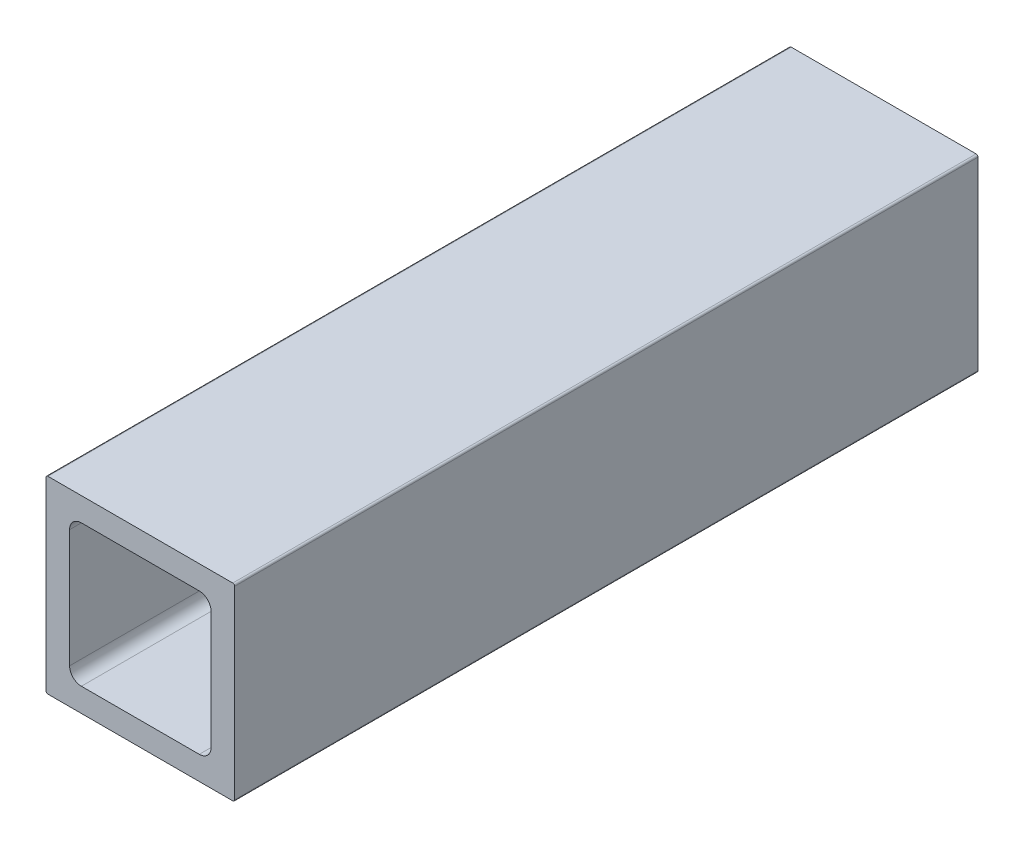
ISO-10303-21;
HEADER;
FILE_DESCRIPTION(('STEP AP214'),'2;1');
FILE_NAME('part.step','',(''),(''),'','','');
FILE_SCHEMA(('AUTOMOTIVE_DESIGN { 1 0 10303 214 1 1 1 1 }'));
ENDSEC;
DATA;
#1=APPLICATION_CONTEXT('core data for automotive mechanical design processes');
#2=APPLICATION_PROTOCOL_DEFINITION('international standard','automotive_design',2000,#1);
#3=PRODUCT_CONTEXT('',#1,'mechanical');
#4=PRODUCT('Part','Part','',(#3));
#5=PRODUCT_RELATED_PRODUCT_CATEGORY('part','',(#4));
#6=PRODUCT_DEFINITION_FORMATION('','',#4);
#7=PRODUCT_DEFINITION_CONTEXT('part definition',#1,'design');
#8=PRODUCT_DEFINITION('design','',#6,#7);
#9=PRODUCT_DEFINITION_SHAPE('','',#8);
#10=(LENGTH_UNIT() NAMED_UNIT(*) SI_UNIT(.MILLI.,.METRE.));
#11=(NAMED_UNIT(*) PLANE_ANGLE_UNIT() SI_UNIT($,.RADIAN.));
#12=(NAMED_UNIT(*) SI_UNIT($,.STERADIAN.) SOLID_ANGLE_UNIT());
#13=UNCERTAINTY_MEASURE_WITH_UNIT(LENGTH_MEASURE(1.E-05),#10,'distance_accuracy_value','');
#14=(GEOMETRIC_REPRESENTATION_CONTEXT(3) GLOBAL_UNCERTAINTY_ASSIGNED_CONTEXT((#13)) GLOBAL_UNIT_ASSIGNED_CONTEXT((#10,
#11,#12)) REPRESENTATION_CONTEXT('',''));
#15=CARTESIAN_POINT('',(0.,0.,0.));
#16=DIRECTION('',(0.,0.,1.));
#17=DIRECTION('',(1.,0.,0.));
#18=AXIS2_PLACEMENT_3D('',#15,#16,#17);
#19=CARTESIAN_POINT('',(0.254,0.254,1828.8));
#20=DIRECTION('',(0.,0.,-1.));
#21=DIRECTION('',(-1.,0.,0.));
#22=AXIS2_PLACEMENT_3D('',#19,#20,#21);
#23=CYLINDRICAL_SURFACE('',#22,0.254);
#24=DIRECTION('',(0.,0.,-1.));
#25=VECTOR('',#24,1.);
#26=CARTESIAN_POINT('',(0.,0.254,1828.8));
#27=LINE('',#26,#25);
#28=CARTESIAN_POINT('',(0.,0.254,1828.8));
#29=VERTEX_POINT('',#28);
#30=CARTESIAN_POINT('',(0.,0.254,1728.724));
#31=VERTEX_POINT('',#30);
#32=EDGE_CURVE('E265',#29,#31,#27,.T.);
#33=ORIENTED_EDGE('',*,*,#32,.T.);
#34=CARTESIAN_POINT('',(0.254,0.254,1728.724));
#35=DIRECTION('',(0.,0.,-1.));
#36=DIRECTION('',(-1.,0.,0.));
#37=AXIS2_PLACEMENT_3D('',#34,#35,#36);
#38=CIRCLE('',#37,0.254);
#39=CARTESIAN_POINT('',(0.254,0.,1728.724));
#40=VERTEX_POINT('',#39);
#41=EDGE_CURVE('E57',#31,#40,#38,.F.);
#42=ORIENTED_EDGE('',*,*,#41,.T.);
#43=DIRECTION('',(0.,0.,-1.));
#44=VECTOR('',#43,1.);
#45=CARTESIAN_POINT('',(0.254,0.,1828.8));
#46=LINE('',#45,#44);
#47=CARTESIAN_POINT('',(0.254,0.,1828.8));
#48=VERTEX_POINT('',#47);
#49=EDGE_CURVE('E261',#48,#40,#46,.T.);
#50=ORIENTED_EDGE('',*,*,#49,.F.);
#51=CARTESIAN_POINT('',(0.254,0.254,1828.8));
#52=DIRECTION('',(0.,0.,1.));
#53=DIRECTION('',(-1.,0.,0.));
#54=AXIS2_PLACEMENT_3D('',#51,#52,#53);
#55=CIRCLE('',#54,0.254);
#56=EDGE_CURVE('E50',#29,#48,#55,.T.);
#57=ORIENTED_EDGE('',*,*,#56,.F.);
#58=EDGE_LOOP('',(#33,#42,#50,#57));
#59=FACE_BOUND('',#58,.T.);
#60=ADVANCED_FACE('F42',(#59),#23,.T.);
#61=CARTESIAN_POINT('',(0.254,0.,1828.8));
#62=DIRECTION('',(0.,1.,0.));
#63=DIRECTION('',(1.,0.,0.));
#64=AXIS2_PLACEMENT_3D('',#61,#62,#63);
#65=PLANE('',#64);
#66=DIRECTION('',(-1.,0.,0.));
#67=VECTOR('',#66,1.);
#68=CARTESIAN_POINT('',(0.254,0.,1728.724));
#69=LINE('',#68,#67);
#70=CARTESIAN_POINT('',(25.146,0.,1728.724));
#71=VERTEX_POINT('',#70);
#72=EDGE_CURVE('E316',#71,#40,#69,.T.);
#73=ORIENTED_EDGE('',*,*,#72,.F.);
#74=DIRECTION('',(0.,0.,-1.));
#75=VECTOR('',#74,1.);
#76=CARTESIAN_POINT('',(25.146,0.,1828.8));
#77=LINE('',#76,#75);
#78=CARTESIAN_POINT('',(25.146,0.,1828.8));
#79=VERTEX_POINT('',#78);
#80=EDGE_CURVE('E215',#79,#71,#77,.T.);
#81=ORIENTED_EDGE('',*,*,#80,.F.);
#82=DIRECTION('',(1.,0.,0.));
#83=VECTOR('',#82,1.);
#84=CARTESIAN_POINT('',(0.254,0.,1828.8));
#85=LINE('',#84,#83);
#86=EDGE_CURVE('E207',#48,#79,#85,.T.);
#87=ORIENTED_EDGE('',*,*,#86,.F.);
#88=ORIENTED_EDGE('',*,*,#49,.T.);
#89=EDGE_LOOP('',(#73,#81,#87,#88));
#90=FACE_BOUND('',#89,.T.);
#91=ADVANCED_FACE('F349',(#90),#65,.F.);
#92=CARTESIAN_POINT('',(25.146,0.254,1828.8));
#93=DIRECTION('',(0.,0.,-1.));
#94=DIRECTION('',(-1.,0.,0.));
#95=AXIS2_PLACEMENT_3D('',#92,#93,#94);
#96=CYLINDRICAL_SURFACE('',#95,0.254);
#97=ORIENTED_EDGE('',*,*,#80,.T.);
#98=CARTESIAN_POINT('',(25.146,0.254,1728.724));
#99=DIRECTION('',(0.,0.,-1.));
#100=DIRECTION('',(-1.,0.,0.));
#101=AXIS2_PLACEMENT_3D('',#98,#99,#100);
#102=CIRCLE('',#101,0.254);
#103=CARTESIAN_POINT('',(25.4,0.254,1728.724));
#104=VERTEX_POINT('',#103);
#105=EDGE_CURVE('E313',#71,#104,#102,.F.);
#106=ORIENTED_EDGE('',*,*,#105,.T.);
#107=DIRECTION('',(0.,0.,-1.));
#108=VECTOR('',#107,1.);
#109=CARTESIAN_POINT('',(25.4,0.254,1828.8));
#110=LINE('',#109,#108);
#111=CARTESIAN_POINT('',(25.4,0.254,1828.8));
#112=VERTEX_POINT('',#111);
#113=EDGE_CURVE('E211',#112,#104,#110,.T.);
#114=ORIENTED_EDGE('',*,*,#113,.F.);
#115=CARTESIAN_POINT('',(25.146,0.254,1828.8));
#116=DIRECTION('',(0.,0.,1.));
#117=DIRECTION('',(1.,0.,0.));
#118=AXIS2_PLACEMENT_3D('',#115,#116,#117);
#119=CIRCLE('',#118,0.254);
#120=EDGE_CURVE('E210',#79,#112,#119,.T.);
#121=ORIENTED_EDGE('',*,*,#120,.F.);
#122=EDGE_LOOP('',(#97,#106,#114,#121));
#123=FACE_BOUND('',#122,.T.);
#124=ADVANCED_FACE('F345',(#123),#96,.T.);
#125=CARTESIAN_POINT('',(25.4,0.254,1828.8));
#126=DIRECTION('',(-1.,0.,0.));
#127=DIRECTION('',(0.,0.,1.));
#128=AXIS2_PLACEMENT_3D('',#125,#126,#127);
#129=PLANE('',#128);
#130=DIRECTION('',(0.,-1.,0.));
#131=VECTOR('',#130,1.);
#132=CARTESIAN_POINT('',(25.4,0.254,1728.724));
#133=LINE('',#132,#131);
#134=CARTESIAN_POINT('',(25.4,25.146,1728.724));
#135=VERTEX_POINT('',#134);
#136=EDGE_CURVE('E311',#135,#104,#133,.T.);
#137=ORIENTED_EDGE('',*,*,#136,.F.);
#138=DIRECTION('',(0.,0.,-1.));
#139=VECTOR('',#138,1.);
#140=CARTESIAN_POINT('',(25.4,25.146,1828.8));
#141=LINE('',#140,#139);
#142=CARTESIAN_POINT('',(25.4,25.146,1828.8));
#143=VERTEX_POINT('',#142);
#144=EDGE_CURVE('E216',#143,#135,#141,.T.);
#145=ORIENTED_EDGE('',*,*,#144,.F.);
#146=DIRECTION('',(0.,1.,0.));
#147=VECTOR('',#146,1.);
#148=CARTESIAN_POINT('',(25.4,0.254,1828.8));
#149=LINE('',#148,#147);
#150=EDGE_CURVE('E231',#112,#143,#149,.T.);
#151=ORIENTED_EDGE('',*,*,#150,.F.);
#152=ORIENTED_EDGE('',*,*,#113,.T.);
#153=EDGE_LOOP('',(#137,#145,#151,#152));
#154=FACE_BOUND('',#153,.T.);
#155=ADVANCED_FACE('F363',(#154),#129,.F.);
#156=CARTESIAN_POINT('',(25.146,25.146,1828.8));
#157=DIRECTION('',(0.,0.,-1.));
#158=DIRECTION('',(-1.,0.,0.));
#159=AXIS2_PLACEMENT_3D('',#156,#157,#158);
#160=CYLINDRICAL_SURFACE('',#159,0.254);
#161=ORIENTED_EDGE('',*,*,#144,.T.);
#162=CARTESIAN_POINT('',(25.146,25.146,1728.724));
#163=DIRECTION('',(0.,0.,-1.));
#164=DIRECTION('',(-1.,0.,0.));
#165=AXIS2_PLACEMENT_3D('',#162,#163,#164);
#166=CIRCLE('',#165,0.254);
#167=CARTESIAN_POINT('',(25.146,25.4,1728.724));
#168=VERTEX_POINT('',#167);
#169=EDGE_CURVE('E308',#135,#168,#166,.F.);
#170=ORIENTED_EDGE('',*,*,#169,.T.);
#171=DIRECTION('',(0.,0.,-1.));
#172=VECTOR('',#171,1.);
#173=CARTESIAN_POINT('',(25.146,25.4,1828.8));
#174=LINE('',#173,#172);
#175=CARTESIAN_POINT('',(25.146,25.4,1828.8));
#176=VERTEX_POINT('',#175);
#177=EDGE_CURVE('E197',#176,#168,#174,.T.);
#178=ORIENTED_EDGE('',*,*,#177,.F.);
#179=CARTESIAN_POINT('',(25.146,25.146,1828.8));
#180=DIRECTION('',(0.,0.,1.));
#181=DIRECTION('',(-1.,0.,0.));
#182=AXIS2_PLACEMENT_3D('',#179,#180,#181);
#183=CIRCLE('',#182,0.254);
#184=EDGE_CURVE('E235',#143,#176,#183,.T.);
#185=ORIENTED_EDGE('',*,*,#184,.F.);
#186=EDGE_LOOP('',(#161,#170,#178,#185));
#187=FACE_BOUND('',#186,.T.);
#188=ADVANCED_FACE('F360',(#187),#160,.T.);
#189=CARTESIAN_POINT('',(0.254,25.4,1828.8));
#190=DIRECTION('',(0.,-1.,0.));
#191=DIRECTION('',(0.,0.,-1.));
#192=AXIS2_PLACEMENT_3D('',#189,#190,#191);
#193=PLANE('',#192);
#194=DIRECTION('',(1.,0.,0.));
#195=VECTOR('',#194,1.);
#196=CARTESIAN_POINT('',(0.254,25.4,1728.724));
#197=LINE('',#196,#195);
#198=CARTESIAN_POINT('',(0.254,25.4,1728.724));
#199=VERTEX_POINT('',#198);
#200=EDGE_CURVE('E184',#199,#168,#197,.T.);
#201=ORIENTED_EDGE('',*,*,#200,.F.);
#202=DIRECTION('',(0.,0.,-1.));
#203=VECTOR('',#202,1.);
#204=CARTESIAN_POINT('',(0.254,25.4,1828.8));
#205=LINE('',#204,#203);
#206=CARTESIAN_POINT('',(0.254,25.4,1828.8));
#207=VERTEX_POINT('',#206);
#208=EDGE_CURVE('E183',#207,#199,#205,.T.);
#209=ORIENTED_EDGE('',*,*,#208,.F.);
#210=DIRECTION('',(-1.,0.,0.));
#211=VECTOR('',#210,1.);
#212=CARTESIAN_POINT('',(0.254,25.4,1828.8));
#213=LINE('',#212,#211);
#214=EDGE_CURVE('E269',#176,#207,#213,.T.);
#215=ORIENTED_EDGE('',*,*,#214,.F.);
#216=ORIENTED_EDGE('',*,*,#177,.T.);
#217=EDGE_LOOP('',(#201,#209,#215,#216));
#218=FACE_BOUND('',#217,.T.);
#219=ADVANCED_FACE('F357',(#218),#193,.F.);
#220=CARTESIAN_POINT('',(0.254,25.146,1828.8));
#221=DIRECTION('',(0.,0.,-1.));
#222=DIRECTION('',(-1.,0.,0.));
#223=AXIS2_PLACEMENT_3D('',#220,#221,#222);
#224=CYLINDRICAL_SURFACE('',#223,0.254);
#225=ORIENTED_EDGE('',*,*,#208,.T.);
#226=CARTESIAN_POINT('',(0.254,25.146,1728.724));
#227=DIRECTION('',(0.,0.,-1.));
#228=DIRECTION('',(-1.,0.,0.));
#229=AXIS2_PLACEMENT_3D('',#226,#227,#228);
#230=CIRCLE('',#229,0.254);
#231=CARTESIAN_POINT('',(0.,25.146,1728.724));
#232=VERTEX_POINT('',#231);
#233=EDGE_CURVE('E170',#199,#232,#230,.F.);
#234=ORIENTED_EDGE('',*,*,#233,.T.);
#235=DIRECTION('',(0.,0.,-1.));
#236=VECTOR('',#235,1.);
#237=CARTESIAN_POINT('',(0.,25.146,1828.8));
#238=LINE('',#237,#236);
#239=CARTESIAN_POINT('',(0.,25.146,1828.8));
#240=VERTEX_POINT('',#239);
#241=EDGE_CURVE('E181',#240,#232,#238,.T.);
#242=ORIENTED_EDGE('',*,*,#241,.F.);
#243=CARTESIAN_POINT('',(0.254,25.146,1828.8));
#244=DIRECTION('',(0.,0.,1.));
#245=DIRECTION('',(-1.,0.,0.));
#246=AXIS2_PLACEMENT_3D('',#243,#244,#245);
#247=CIRCLE('',#246,0.254);
#248=EDGE_CURVE('E266',#207,#240,#247,.T.);
#249=ORIENTED_EDGE('',*,*,#248,.F.);
#250=EDGE_LOOP('',(#225,#234,#242,#249));
#251=FACE_BOUND('',#250,.T.);
#252=ADVANCED_FACE('F180',(#251),#224,.T.);
#253=CARTESIAN_POINT('',(0.,0.254,1828.8));
#254=DIRECTION('',(1.,0.,0.));
#255=DIRECTION('',(0.,1.,0.));
#256=AXIS2_PLACEMENT_3D('',#253,#254,#255);
#257=PLANE('',#256);
#258=DIRECTION('',(0.,-1.,0.));
#259=VECTOR('',#258,1.);
#260=CARTESIAN_POINT('',(0.,128.21449467067,1728.724));
#261=LINE('',#260,#259);
#262=EDGE_CURVE('E167',#232,#31,#261,.T.);
#263=ORIENTED_EDGE('',*,*,#262,.T.);
#264=ORIENTED_EDGE('',*,*,#32,.F.);
#265=DIRECTION('',(0.,-1.,0.));
#266=VECTOR('',#265,1.);
#267=CARTESIAN_POINT('',(0.,0.254,1828.8));
#268=LINE('',#267,#266);
#269=EDGE_CURVE('E188',#240,#29,#268,.T.);
#270=ORIENTED_EDGE('',*,*,#269,.F.);
#271=ORIENTED_EDGE('',*,*,#241,.T.);
#272=EDGE_LOOP('',(#263,#264,#270,#271));
#273=FACE_BOUND('',#272,.T.);
#274=ADVANCED_FACE('F187',(#273),#257,.F.);
#275=CARTESIAN_POINT('',(4.7625,4.7625,1828.8));
#276=DIRECTION('',(0.,0.,-1.));
#277=DIRECTION('',(-1.,0.,0.));
#278=AXIS2_PLACEMENT_3D('',#275,#276,#277);
#279=CYLINDRICAL_SURFACE('',#278,1.5875);
#280=CARTESIAN_POINT('',(4.7625,4.7625,1728.724));
#281=DIRECTION('',(0.,0.,-1.));
#282=DIRECTION('',(-1.,0.,0.));
#283=AXIS2_PLACEMENT_3D('',#280,#281,#282);
#284=CIRCLE('',#283,1.5875);
#285=CARTESIAN_POINT('',(3.175,4.7625,1728.724));
#286=VERTEX_POINT('',#285);
#287=CARTESIAN_POINT('',(4.7625,3.175,1728.724));
#288=VERTEX_POINT('',#287);
#289=EDGE_CURVE('E185',#286,#288,#284,.F.);
#290=ORIENTED_EDGE('',*,*,#289,.F.);
#291=DIRECTION('',(0.,0.,-1.));
#292=VECTOR('',#291,1.);
#293=CARTESIAN_POINT('',(3.175,4.7625,1828.8));
#294=LINE('',#293,#292);
#295=CARTESIAN_POINT('',(3.175,4.7625,1828.8));
#296=VERTEX_POINT('',#295);
#297=EDGE_CURVE('E244',#296,#286,#294,.T.);
#298=ORIENTED_EDGE('',*,*,#297,.F.);
#299=CARTESIAN_POINT('',(4.7625,4.7625,1828.8));
#300=DIRECTION('',(0.,0.,1.));
#301=DIRECTION('',(1.,0.,0.));
#302=AXIS2_PLACEMENT_3D('',#299,#300,#301);
#303=CIRCLE('',#302,1.5875);
#304=CARTESIAN_POINT('',(4.7625,3.175,1828.8));
#305=VERTEX_POINT('',#304);
#306=EDGE_CURVE('E191',#296,#305,#303,.T.);
#307=ORIENTED_EDGE('',*,*,#306,.T.);
#308=DIRECTION('',(0.,0.,-1.));
#309=VECTOR('',#308,1.);
#310=CARTESIAN_POINT('',(4.7625,3.175,1828.8));
#311=LINE('',#310,#309);
#312=EDGE_CURVE('E201',#305,#288,#311,.T.);
#313=ORIENTED_EDGE('',*,*,#312,.T.);
#314=EDGE_LOOP('',(#290,#298,#307,#313));
#315=FACE_BOUND('',#314,.T.);
#316=ADVANCED_FACE('F44',(#315),#279,.F.);
#317=CARTESIAN_POINT('',(4.7625,3.175,1828.8));
#318=DIRECTION('',(0.,1.,0.));
#319=DIRECTION('',(1.,0.,0.));
#320=AXIS2_PLACEMENT_3D('',#317,#318,#319);
#321=PLANE('',#320);
#322=DIRECTION('',(0.,0.,-1.));
#323=VECTOR('',#322,1.);
#324=CARTESIAN_POINT('',(20.6375,3.175,1828.8));
#325=LINE('',#324,#323);
#326=CARTESIAN_POINT('',(20.6375,3.175,1828.8));
#327=VERTEX_POINT('',#326);
#328=CARTESIAN_POINT('',(20.6375,3.175,1728.724));
#329=VERTEX_POINT('',#328);
#330=EDGE_CURVE('E225',#327,#329,#325,.T.);
#331=ORIENTED_EDGE('',*,*,#330,.T.);
#332=DIRECTION('',(-1.,0.,0.));
#333=VECTOR('',#332,1.);
#334=CARTESIAN_POINT('',(4.7625,3.175,1728.724));
#335=LINE('',#334,#333);
#336=EDGE_CURVE('E298',#329,#288,#335,.T.);
#337=ORIENTED_EDGE('',*,*,#336,.T.);
#338=ORIENTED_EDGE('',*,*,#312,.F.);
#339=DIRECTION('',(1.,0.,0.));
#340=VECTOR('',#339,1.);
#341=CARTESIAN_POINT('',(4.7625,3.175,1828.8));
#342=LINE('',#341,#340);
#343=EDGE_CURVE('E229',#305,#327,#342,.T.);
#344=ORIENTED_EDGE('',*,*,#343,.T.);
#345=EDGE_LOOP('',(#331,#337,#338,#344));
#346=FACE_BOUND('',#345,.T.);
#347=ADVANCED_FACE('F287',(#346),#321,.T.);
#348=CARTESIAN_POINT('',(20.6375,4.7625,1828.8));
#349=DIRECTION('',(0.,0.,-1.));
#350=DIRECTION('',(-1.,0.,0.));
#351=AXIS2_PLACEMENT_3D('',#348,#349,#350);
#352=CYLINDRICAL_SURFACE('',#351,1.5875);
#353=CARTESIAN_POINT('',(20.6375,4.7625,1728.724));
#354=DIRECTION('',(0.,0.,-1.));
#355=DIRECTION('',(-1.,0.,0.));
#356=AXIS2_PLACEMENT_3D('',#353,#354,#355);
#357=CIRCLE('',#356,1.5875);
#358=CARTESIAN_POINT('',(22.225,4.7625,1728.724));
#359=VERTEX_POINT('',#358);
#360=EDGE_CURVE('E296',#329,#359,#357,.F.);
#361=ORIENTED_EDGE('',*,*,#360,.F.);
#362=ORIENTED_EDGE('',*,*,#330,.F.);
#363=CARTESIAN_POINT('',(20.6375,4.7625,1828.8));
#364=DIRECTION('',(0.,0.,1.));
#365=DIRECTION('',(-1.,0.,0.));
#366=AXIS2_PLACEMENT_3D('',#363,#364,#365);
#367=CIRCLE('',#366,1.5875);
#368=CARTESIAN_POINT('',(22.225,4.7625,1828.8));
#369=VERTEX_POINT('',#368);
#370=EDGE_CURVE('E230',#327,#369,#367,.T.);
#371=ORIENTED_EDGE('',*,*,#370,.T.);
#372=DIRECTION('',(0.,0.,-1.));
#373=VECTOR('',#372,1.);
#374=CARTESIAN_POINT('',(22.225,4.7625,1828.8));
#375=LINE('',#374,#373);
#376=EDGE_CURVE('E224',#369,#359,#375,.T.);
#377=ORIENTED_EDGE('',*,*,#376,.T.);
#378=EDGE_LOOP('',(#361,#362,#371,#377));
#379=FACE_BOUND('',#378,.T.);
#380=ADVANCED_FACE('F293',(#379),#352,.F.);
#381=CARTESIAN_POINT('',(22.225,4.7625,1828.8));
#382=DIRECTION('',(-1.,0.,0.));
#383=DIRECTION('',(0.,0.,1.));
#384=AXIS2_PLACEMENT_3D('',#381,#382,#383);
#385=PLANE('',#384);
#386=DIRECTION('',(0.,0.,-1.));
#387=VECTOR('',#386,1.);
#388=CARTESIAN_POINT('',(22.225,20.6375,1828.8));
#389=LINE('',#388,#387);
#390=CARTESIAN_POINT('',(22.225,20.6375,1828.8));
#391=VERTEX_POINT('',#390);
#392=CARTESIAN_POINT('',(22.225,20.6375,1728.724));
#393=VERTEX_POINT('',#392);
#394=EDGE_CURVE('E205',#391,#393,#389,.T.);
#395=ORIENTED_EDGE('',*,*,#394,.T.);
#396=DIRECTION('',(0.,-1.,0.));
#397=VECTOR('',#396,1.);
#398=CARTESIAN_POINT('',(22.225,4.7625,1728.724));
#399=LINE('',#398,#397);
#400=EDGE_CURVE('E299',#393,#359,#399,.T.);
#401=ORIENTED_EDGE('',*,*,#400,.T.);
#402=ORIENTED_EDGE('',*,*,#376,.F.);
#403=DIRECTION('',(0.,1.,0.));
#404=VECTOR('',#403,1.);
#405=CARTESIAN_POINT('',(22.225,4.7625,1828.8));
#406=LINE('',#405,#404);
#407=EDGE_CURVE('E220',#369,#391,#406,.T.);
#408=ORIENTED_EDGE('',*,*,#407,.T.);
#409=EDGE_LOOP('',(#395,#401,#402,#408));
#410=FACE_BOUND('',#409,.T.);
#411=ADVANCED_FACE('F384',(#410),#385,.T.);
#412=CARTESIAN_POINT('',(20.6375,20.6375,1828.8));
#413=DIRECTION('',(0.,0.,-1.));
#414=DIRECTION('',(-1.,0.,0.));
#415=AXIS2_PLACEMENT_3D('',#412,#413,#414);
#416=CYLINDRICAL_SURFACE('',#415,1.5875);
#417=CARTESIAN_POINT('',(20.6375,20.6375,1728.724));
#418=DIRECTION('',(0.,0.,-1.));
#419=DIRECTION('',(-1.,0.,0.));
#420=AXIS2_PLACEMENT_3D('',#417,#418,#419);
#421=CIRCLE('',#420,1.5875);
#422=CARTESIAN_POINT('',(20.6375,22.225,1728.724));
#423=VERTEX_POINT('',#422);
#424=EDGE_CURVE('E302',#393,#423,#421,.F.);
#425=ORIENTED_EDGE('',*,*,#424,.F.);
#426=ORIENTED_EDGE('',*,*,#394,.F.);
#427=CARTESIAN_POINT('',(20.6375,20.6375,1828.8));
#428=DIRECTION('',(0.,0.,1.));
#429=DIRECTION('',(-1.,0.,0.));
#430=AXIS2_PLACEMENT_3D('',#427,#428,#429);
#431=CIRCLE('',#430,1.5875);
#432=CARTESIAN_POINT('',(20.6375,22.225,1828.8));
#433=VERTEX_POINT('',#432);
#434=EDGE_CURVE('E236',#391,#433,#431,.T.);
#435=ORIENTED_EDGE('',*,*,#434,.T.);
#436=DIRECTION('',(0.,0.,-1.));
#437=VECTOR('',#436,1.);
#438=CARTESIAN_POINT('',(20.6375,22.225,1828.8));
#439=LINE('',#438,#437);
#440=EDGE_CURVE('E240',#433,#423,#439,.T.);
#441=ORIENTED_EDGE('',*,*,#440,.T.);
#442=EDGE_LOOP('',(#425,#426,#435,#441));
#443=FACE_BOUND('',#442,.T.);
#444=ADVANCED_FACE('F392',(#443),#416,.F.);
#445=CARTESIAN_POINT('',(4.7625,22.225,1828.8));
#446=DIRECTION('',(0.,-1.,0.));
#447=DIRECTION('',(0.,0.,-1.));
#448=AXIS2_PLACEMENT_3D('',#445,#446,#447);
#449=PLANE('',#448);
#450=DIRECTION('',(0.,0.,-1.));
#451=VECTOR('',#450,1.);
#452=CARTESIAN_POINT('',(4.7625,22.225,1828.8));
#453=LINE('',#452,#451);
#454=CARTESIAN_POINT('',(4.7625,22.225,1828.8));
#455=VERTEX_POINT('',#454);
#456=CARTESIAN_POINT('',(4.7625,22.225,1728.724));
#457=VERTEX_POINT('',#456);
#458=EDGE_CURVE('E249',#455,#457,#453,.T.);
#459=ORIENTED_EDGE('',*,*,#458,.T.);
#460=DIRECTION('',(1.,0.,0.));
#461=VECTOR('',#460,1.);
#462=CARTESIAN_POINT('',(4.7625,22.225,1728.724));
#463=LINE('',#462,#461);
#464=EDGE_CURVE('E419',#457,#423,#463,.T.);
#465=ORIENTED_EDGE('',*,*,#464,.T.);
#466=ORIENTED_EDGE('',*,*,#440,.F.);
#467=DIRECTION('',(-1.,0.,0.));
#468=VECTOR('',#467,1.);
#469=CARTESIAN_POINT('',(4.7625,22.225,1828.8));
#470=LINE('',#469,#468);
#471=EDGE_CURVE('E253',#433,#455,#470,.T.);
#472=ORIENTED_EDGE('',*,*,#471,.T.);
#473=EDGE_LOOP('',(#459,#465,#466,#472));
#474=FACE_BOUND('',#473,.T.);
#475=ADVANCED_FACE('F395',(#474),#449,.T.);
#476=CARTESIAN_POINT('',(4.7625,20.6375,1828.8));
#477=DIRECTION('',(0.,0.,-1.));
#478=DIRECTION('',(-1.,0.,0.));
#479=AXIS2_PLACEMENT_3D('',#476,#477,#478);
#480=CYLINDRICAL_SURFACE('',#479,1.5875);
#481=CARTESIAN_POINT('',(4.7625,20.6375,1728.724));
#482=DIRECTION('',(0.,0.,-1.));
#483=DIRECTION('',(-1.,0.,0.));
#484=AXIS2_PLACEMENT_3D('',#481,#482,#483);
#485=CIRCLE('',#484,1.5875);
#486=CARTESIAN_POINT('',(3.175,20.6375,1728.724));
#487=VERTEX_POINT('',#486);
#488=EDGE_CURVE('E65',#457,#487,#485,.F.);
#489=ORIENTED_EDGE('',*,*,#488,.F.);
#490=ORIENTED_EDGE('',*,*,#458,.F.);
#491=CARTESIAN_POINT('',(4.7625,20.6375,1828.8));
#492=DIRECTION('',(0.,0.,1.));
#493=DIRECTION('',(-1.,0.,0.));
#494=AXIS2_PLACEMENT_3D('',#491,#492,#493);
#495=CIRCLE('',#494,1.5875);
#496=CARTESIAN_POINT('',(3.175,20.6375,1828.8));
#497=VERTEX_POINT('',#496);
#498=EDGE_CURVE('E254',#455,#497,#495,.T.);
#499=ORIENTED_EDGE('',*,*,#498,.T.);
#500=DIRECTION('',(0.,0.,-1.));
#501=VECTOR('',#500,1.);
#502=CARTESIAN_POINT('',(3.175,20.6375,1828.8));
#503=LINE('',#502,#501);
#504=EDGE_CURVE('E322',#497,#487,#503,.T.);
#505=ORIENTED_EDGE('',*,*,#504,.T.);
#506=EDGE_LOOP('',(#489,#490,#499,#505));
#507=FACE_BOUND('',#506,.T.);
#508=ADVANCED_FACE('F390',(#507),#480,.F.);
#509=CARTESIAN_POINT('',(3.175,4.7625,1828.8));
#510=DIRECTION('',(1.,0.,0.));
#511=DIRECTION('',(0.,1.,0.));
#512=AXIS2_PLACEMENT_3D('',#509,#510,#511);
#513=PLANE('',#512);
#514=ORIENTED_EDGE('',*,*,#297,.T.);
#515=DIRECTION('',(0.,1.,0.));
#516=VECTOR('',#515,1.);
#517=CARTESIAN_POINT('',(3.175,4.7625,1728.724));
#518=LINE('',#517,#516);
#519=EDGE_CURVE('E11',#286,#487,#518,.T.);
#520=ORIENTED_EDGE('',*,*,#519,.T.);
#521=ORIENTED_EDGE('',*,*,#504,.F.);
#522=DIRECTION('',(0.,-1.,0.));
#523=VECTOR('',#522,1.);
#524=CARTESIAN_POINT('',(3.175,4.7625,1828.8));
#525=LINE('',#524,#523);
#526=EDGE_CURVE('E248',#497,#296,#525,.T.);
#527=ORIENTED_EDGE('',*,*,#526,.T.);
#528=EDGE_LOOP('',(#514,#520,#521,#527));
#529=FACE_BOUND('',#528,.T.);
#530=ADVANCED_FACE('F387',(#529),#513,.T.);
#531=CARTESIAN_POINT('',(0.254,0.254,1828.8));
#532=DIRECTION('',(0.,0.,-1.));
#533=DIRECTION('',(0.,-1.,0.));
#534=AXIS2_PLACEMENT_3D('',#531,#532,#533);
#535=PLANE('',#534);
#536=ORIENTED_EDGE('',*,*,#56,.T.);
#537=ORIENTED_EDGE('',*,*,#86,.T.);
#538=ORIENTED_EDGE('',*,*,#120,.T.);
#539=ORIENTED_EDGE('',*,*,#150,.T.);
#540=ORIENTED_EDGE('',*,*,#184,.T.);
#541=ORIENTED_EDGE('',*,*,#214,.T.);
#542=ORIENTED_EDGE('',*,*,#248,.T.);
#543=ORIENTED_EDGE('',*,*,#269,.T.);
#544=EDGE_LOOP('',(#536,#537,#538,#539,#540,#541,#542,#543));
#545=FACE_BOUND('',#544,.T.);
#546=ORIENTED_EDGE('',*,*,#306,.F.);
#547=ORIENTED_EDGE('',*,*,#526,.F.);
#548=ORIENTED_EDGE('',*,*,#498,.F.);
#549=ORIENTED_EDGE('',*,*,#471,.F.);
#550=ORIENTED_EDGE('',*,*,#434,.F.);
#551=ORIENTED_EDGE('',*,*,#407,.F.);
#552=ORIENTED_EDGE('',*,*,#370,.F.);
#553=ORIENTED_EDGE('',*,*,#343,.F.);
#554=EDGE_LOOP('',(#546,#547,#548,#549,#550,#551,#552,#553));
#555=FACE_BOUND('',#554,.T.);
#556=ADVANCED_FACE('F354',(#545,#555),#535,.F.);
#557=CARTESIAN_POINT('',(76.2,128.21449467067,1728.724));
#558=DIRECTION('',(0.,0.,-1.));
#559=DIRECTION('',(-1.,0.,0.));
#560=AXIS2_PLACEMENT_3D('',#557,#558,#559);
#561=PLANE('',#560);
#562=ORIENTED_EDGE('',*,*,#262,.F.);
#563=ORIENTED_EDGE('',*,*,#233,.F.);
#564=ORIENTED_EDGE('',*,*,#200,.T.);
#565=ORIENTED_EDGE('',*,*,#169,.F.);
#566=ORIENTED_EDGE('',*,*,#136,.T.);
#567=ORIENTED_EDGE('',*,*,#105,.F.);
#568=ORIENTED_EDGE('',*,*,#72,.T.);
#569=ORIENTED_EDGE('',*,*,#41,.F.);
#570=EDGE_LOOP('',(#562,#563,#564,#565,#566,#567,#568,#569));
#571=FACE_BOUND('',#570,.T.);
#572=ORIENTED_EDGE('',*,*,#289,.T.);
#573=ORIENTED_EDGE('',*,*,#336,.F.);
#574=ORIENTED_EDGE('',*,*,#360,.T.);
#575=ORIENTED_EDGE('',*,*,#400,.F.);
#576=ORIENTED_EDGE('',*,*,#424,.T.);
#577=ORIENTED_EDGE('',*,*,#464,.F.);
#578=ORIENTED_EDGE('',*,*,#488,.T.);
#579=ORIENTED_EDGE('',*,*,#519,.F.);
#580=EDGE_LOOP('',(#572,#573,#574,#575,#576,#577,#578,#579));
#581=FACE_BOUND('',#580,.T.);
#582=ADVANCED_FACE('F169',(#571,#581),#561,.T.);
#583=CLOSED_SHELL('',(#60,#91,#124,#155,#188,#219,#252,#274,#316,#347,#380,#411,#444,#475,#508,
#530,#556,#582));
#584=MANIFOLD_SOLID_BREP('B2',#583);
#585=ADVANCED_BREP_SHAPE_REPRESENTATION('',(#18,#584),#14);
#586=SHAPE_DEFINITION_REPRESENTATION(#9,#585);
ENDSEC;
END-ISO-10303-21;
